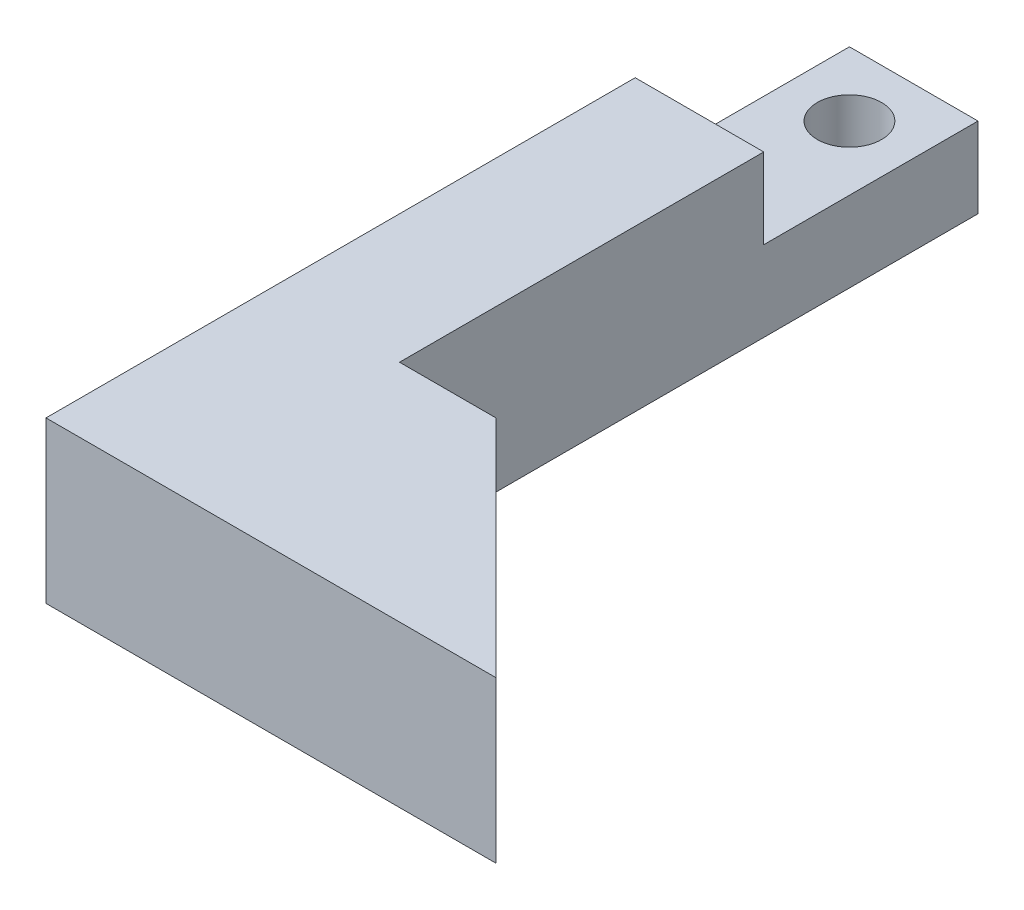
ISO-10303-21;
HEADER;
FILE_DESCRIPTION(('STEP AP214'),'2;1');
FILE_NAME('part.step','',(''),(''),'','','');
FILE_SCHEMA(('AUTOMOTIVE_DESIGN { 1 0 10303 214 1 1 1 1 }'));
ENDSEC;
DATA;
#1=APPLICATION_CONTEXT('core data for automotive mechanical design processes');
#2=APPLICATION_PROTOCOL_DEFINITION('international standard','automotive_design',2000,#1);
#3=PRODUCT_CONTEXT('',#1,'mechanical');
#4=PRODUCT('Part','Part','',(#3));
#5=PRODUCT_RELATED_PRODUCT_CATEGORY('part','',(#4));
#6=PRODUCT_DEFINITION_FORMATION('','',#4);
#7=PRODUCT_DEFINITION_CONTEXT('part definition',#1,'design');
#8=PRODUCT_DEFINITION('design','',#6,#7);
#9=PRODUCT_DEFINITION_SHAPE('','',#8);
#10=(LENGTH_UNIT() NAMED_UNIT(*) SI_UNIT(.MILLI.,.METRE.));
#11=(NAMED_UNIT(*) PLANE_ANGLE_UNIT() SI_UNIT($,.RADIAN.));
#12=(NAMED_UNIT(*) SI_UNIT($,.STERADIAN.) SOLID_ANGLE_UNIT());
#13=UNCERTAINTY_MEASURE_WITH_UNIT(LENGTH_MEASURE(1.E-05),#10,'distance_accuracy_value','');
#14=(GEOMETRIC_REPRESENTATION_CONTEXT(3) GLOBAL_UNCERTAINTY_ASSIGNED_CONTEXT((#13)) GLOBAL_UNIT_ASSIGNED_CONTEXT((#10,
#11,#12)) REPRESENTATION_CONTEXT('',''));
#15=CARTESIAN_POINT('',(0.,0.,0.));
#16=DIRECTION('',(0.,0.,1.));
#17=DIRECTION('',(1.,0.,0.));
#18=AXIS2_PLACEMENT_3D('',#15,#16,#17);
#19=CARTESIAN_POINT('',(-10.5540619028805,43.75,-62.8774836734675));
#20=DIRECTION('',(0.,0.,1.));
#21=DIRECTION('',(1.,0.,0.));
#22=AXIS2_PLACEMENT_3D('',#19,#20,#21);
#23=PLANE('',#22);
#24=DIRECTION('',(-1.,0.,0.));
#25=VECTOR('',#24,1.);
#26=CARTESIAN_POINT('',(-10.5540619028805,25.,-62.8774836734675));
#27=LINE('',#26,#25);
#28=CARTESIAN_POINT('',(19.4459380971195,25.,-62.8774836734675));
#29=VERTEX_POINT('',#28);
#30=CARTESIAN_POINT('',(-10.5540619028805,25.,-62.8774836734675));
#31=VERTEX_POINT('',#30);
#32=EDGE_CURVE('E291',#29,#31,#27,.T.);
#33=ORIENTED_EDGE('',*,*,#32,.F.);
#34=DIRECTION('',(0.,-1.,0.));
#35=VECTOR('',#34,1.);
#36=CARTESIAN_POINT('',(19.4459380971195,43.75,-62.8774836734675));
#37=LINE('',#36,#35);
#38=CARTESIAN_POINT('',(19.4459380971195,6.25,-62.8774836734675));
#39=VERTEX_POINT('',#38);
#40=EDGE_CURVE('E329',#29,#39,#37,.T.);
#41=ORIENTED_EDGE('',*,*,#40,.T.);
#42=DIRECTION('',(-1.,0.,0.));
#43=VECTOR('',#42,1.);
#44=CARTESIAN_POINT('',(-10.5540619028805,6.25,-62.8774836734675));
#45=LINE('',#44,#43);
#46=CARTESIAN_POINT('',(-10.5540619028805,6.25,-62.8774836734675));
#47=VERTEX_POINT('',#46);
#48=EDGE_CURVE('E325',#39,#47,#45,.T.);
#49=ORIENTED_EDGE('',*,*,#48,.T.);
#50=DIRECTION('',(0.,-1.,0.));
#51=VECTOR('',#50,1.);
#52=CARTESIAN_POINT('',(-10.5540619028805,43.75,-62.8774836734675));
#53=LINE('',#52,#51);
#54=EDGE_CURVE('E327',#31,#47,#53,.T.);
#55=ORIENTED_EDGE('',*,*,#54,.F.);
#56=EDGE_LOOP('',(#33,#41,#49,#55));
#57=FACE_BOUND('',#56,.T.);
#58=ADVANCED_FACE('F202',(#57),#23,.F.);
#59=CARTESIAN_POINT('',(-10.5540619028805,43.75,-62.8774836734675));
#60=DIRECTION('',(1.,0.,0.));
#61=DIRECTION('',(0.,0.,-1.));
#62=AXIS2_PLACEMENT_3D('',#59,#60,#61);
#63=PLANE('',#62);
#64=DIRECTION('',(0.,0.,1.));
#65=VECTOR('',#64,1.);
#66=CARTESIAN_POINT('',(-10.5540619028805,25.,-62.8774836734675));
#67=LINE('',#66,#65);
#68=CARTESIAN_POINT('',(-10.5540619028805,25.,-12.8774836734675));
#69=VERTEX_POINT('',#68);
#70=EDGE_CURVE('E289',#31,#69,#67,.T.);
#71=ORIENTED_EDGE('',*,*,#70,.F.);
#72=ORIENTED_EDGE('',*,*,#54,.T.);
#73=DIRECTION('',(0.,0.,1.));
#74=VECTOR('',#73,1.);
#75=CARTESIAN_POINT('',(-10.5540619028805,6.25,-62.8774836734675));
#76=LINE('',#75,#74);
#77=CARTESIAN_POINT('',(-10.5540619028804,6.25,124.622516326533));
#78=VERTEX_POINT('',#77);
#79=EDGE_CURVE('E256',#47,#78,#76,.T.);
#80=ORIENTED_EDGE('',*,*,#79,.T.);
#81=DIRECTION('',(0.,-1.,0.));
#82=VECTOR('',#81,1.);
#83=CARTESIAN_POINT('',(-10.5540619028804,43.75,124.622516326533));
#84=LINE('',#83,#82);
#85=CARTESIAN_POINT('',(-10.5540619028804,43.75,124.622516326533));
#86=VERTEX_POINT('',#85);
#87=EDGE_CURVE('E311',#86,#78,#84,.T.);
#88=ORIENTED_EDGE('',*,*,#87,.F.);
#89=DIRECTION('',(0.,0.,1.));
#90=VECTOR('',#89,1.);
#91=CARTESIAN_POINT('',(-10.5540619028805,43.75,-62.8774836734675));
#92=LINE('',#91,#90);
#93=CARTESIAN_POINT('',(-10.5540619028805,43.75,-12.8774836734675));
#94=VERTEX_POINT('',#93);
#95=EDGE_CURVE('E229',#94,#86,#92,.T.);
#96=ORIENTED_EDGE('',*,*,#95,.F.);
#97=DIRECTION('',(0.,1.,0.));
#98=VECTOR('',#97,1.);
#99=CARTESIAN_POINT('',(-10.5540619028805,25.,-12.8774836734675));
#100=LINE('',#99,#98);
#101=EDGE_CURVE('E225',#69,#94,#100,.T.);
#102=ORIENTED_EDGE('',*,*,#101,.F.);
#103=EDGE_LOOP('',(#71,#72,#80,#88,#96,#102));
#104=FACE_BOUND('',#103,.T.);
#105=ADVANCED_FACE('F300',(#104),#63,.F.);
#106=CARTESIAN_POINT('',(4.44593809711955,-14.,-47.8774836734675));
#107=DIRECTION('',(0.,1.,0.));
#108=DIRECTION('',(0.,0.,1.));
#109=AXIS2_PLACEMENT_3D('',#106,#107,#108);
#110=CYLINDRICAL_SURFACE('',#109,7.5);
#111=CARTESIAN_POINT('',(4.44593809711955,6.25,-47.8774836734675));
#112=DIRECTION('',(0.,1.,0.));
#113=DIRECTION('',(0.,0.,1.));
#114=AXIS2_PLACEMENT_3D('',#111,#112,#113);
#115=CIRCLE('',#114,7.5);
#116=CARTESIAN_POINT('',(4.44593809711955,6.25,-40.3774836734675));
#117=VERTEX_POINT('',#116);
#118=EDGE_CURVE('E320',#117,#117,#115,.T.);
#119=ORIENTED_EDGE('',*,*,#118,.F.);
#120=EDGE_LOOP('',(#119));
#121=FACE_BOUND('',#120,.T.);
#122=CARTESIAN_POINT('',(4.44593809711955,25.,-47.8774836734675));
#123=DIRECTION('',(0.,1.,0.));
#124=DIRECTION('',(0.,0.,1.));
#125=AXIS2_PLACEMENT_3D('',#122,#123,#124);
#126=CIRCLE('',#125,7.5);
#127=CARTESIAN_POINT('',(4.44593809711955,25.,-40.3774836734675));
#128=VERTEX_POINT('',#127);
#129=EDGE_CURVE('E207',#128,#128,#126,.F.);
#130=ORIENTED_EDGE('',*,*,#129,.F.);
#131=EDGE_LOOP('',(#130));
#132=FACE_BOUND('',#131,.T.);
#133=ADVANCED_FACE('F344',(#121,#132),#110,.F.);
#134=CARTESIAN_POINT('',(41.9459380971196,43.75,72.1225163265324));
#135=DIRECTION('',(-0.707106781186546,0.,0.707106781186549));
#136=DIRECTION('',(0.707106781186549,0.,0.707106781186546));
#137=AXIS2_PLACEMENT_3D('',#134,#135,#136);
#138=PLANE('',#137);
#139=DIRECTION('',(-0.707106781186549,0.,-0.707106781186546));
#140=VECTOR('',#139,1.);
#141=CARTESIAN_POINT('',(41.9459380971196,6.25,72.1225163265324));
#142=LINE('',#141,#140);
#143=CARTESIAN_POINT('',(94.4459380971198,6.25,124.622516326532));
#144=VERTEX_POINT('',#143);
#145=CARTESIAN_POINT('',(41.9459380971196,6.25,72.1225163265324));
#146=VERTEX_POINT('',#145);
#147=EDGE_CURVE('E314',#144,#146,#142,.T.);
#148=ORIENTED_EDGE('',*,*,#147,.T.);
#149=DIRECTION('',(0.,-1.,0.));
#150=VECTOR('',#149,1.);
#151=CARTESIAN_POINT('',(41.9459380971196,43.75,72.1225163265324));
#152=LINE('',#151,#150);
#153=CARTESIAN_POINT('',(41.9459380971196,43.75,72.1225163265324));
#154=VERTEX_POINT('',#153);
#155=EDGE_CURVE('E212',#154,#146,#152,.T.);
#156=ORIENTED_EDGE('',*,*,#155,.F.);
#157=DIRECTION('',(-0.707106781186549,0.,-0.707106781186546));
#158=VECTOR('',#157,1.);
#159=CARTESIAN_POINT('',(41.9459380971196,43.75,72.1225163265324));
#160=LINE('',#159,#158);
#161=CARTESIAN_POINT('',(94.4459380971198,43.75,124.622516326532));
#162=VERTEX_POINT('',#161);
#163=EDGE_CURVE('E264',#162,#154,#160,.T.);
#164=ORIENTED_EDGE('',*,*,#163,.F.);
#165=DIRECTION('',(0.,-1.,0.));
#166=VECTOR('',#165,1.);
#167=CARTESIAN_POINT('',(94.4459380971198,43.75,124.622516326532));
#168=LINE('',#167,#166);
#169=EDGE_CURVE('E13',#162,#144,#168,.T.);
#170=ORIENTED_EDGE('',*,*,#169,.T.);
#171=EDGE_LOOP('',(#148,#156,#164,#170));
#172=FACE_BOUND('',#171,.T.);
#173=ADVANCED_FACE('F210',(#172),#138,.F.);
#174=CARTESIAN_POINT('',(19.4459380971195,43.75,72.1225163265324));
#175=DIRECTION('',(0.,0.,1.));
#176=DIRECTION('',(1.,0.,0.));
#177=AXIS2_PLACEMENT_3D('',#174,#175,#176);
#178=PLANE('',#177);
#179=DIRECTION('',(-1.,0.,0.));
#180=VECTOR('',#179,1.);
#181=CARTESIAN_POINT('',(19.4459380971195,6.25,72.1225163265324));
#182=LINE('',#181,#180);
#183=CARTESIAN_POINT('',(19.4459380971195,6.25,72.1225163265324));
#184=VERTEX_POINT('',#183);
#185=EDGE_CURVE('E316',#146,#184,#182,.T.);
#186=ORIENTED_EDGE('',*,*,#185,.T.);
#187=DIRECTION('',(0.,-1.,0.));
#188=VECTOR('',#187,1.);
#189=CARTESIAN_POINT('',(19.4459380971195,43.75,72.1225163265324));
#190=LINE('',#189,#188);
#191=CARTESIAN_POINT('',(19.4459380971195,43.75,72.1225163265324));
#192=VERTEX_POINT('',#191);
#193=EDGE_CURVE('E335',#192,#184,#190,.T.);
#194=ORIENTED_EDGE('',*,*,#193,.F.);
#195=DIRECTION('',(-1.,0.,0.));
#196=VECTOR('',#195,1.);
#197=CARTESIAN_POINT('',(19.4459380971195,43.75,72.1225163265324));
#198=LINE('',#197,#196);
#199=EDGE_CURVE('E307',#154,#192,#198,.T.);
#200=ORIENTED_EDGE('',*,*,#199,.F.);
#201=ORIENTED_EDGE('',*,*,#155,.T.);
#202=EDGE_LOOP('',(#186,#194,#200,#201));
#203=FACE_BOUND('',#202,.T.);
#204=ADVANCED_FACE('F348',(#203),#178,.F.);
#205=CARTESIAN_POINT('',(19.4459380971195,43.75,72.1225163265324));
#206=DIRECTION('',(-1.,0.,0.));
#207=DIRECTION('',(0.,0.,1.));
#208=AXIS2_PLACEMENT_3D('',#205,#206,#207);
#209=PLANE('',#208);
#210=DIRECTION('',(0.,0.,-1.));
#211=VECTOR('',#210,1.);
#212=CARTESIAN_POINT('',(19.4459380971195,25.,-62.8774836734675));
#213=LINE('',#212,#211);
#214=CARTESIAN_POINT('',(19.4459380971195,25.,-12.8774836734675));
#215=VERTEX_POINT('',#214);
#216=EDGE_CURVE('E287',#215,#29,#213,.T.);
#217=ORIENTED_EDGE('',*,*,#216,.F.);
#218=DIRECTION('',(0.,1.,0.));
#219=VECTOR('',#218,1.);
#220=CARTESIAN_POINT('',(19.4459380971195,25.,-12.8774836734675));
#221=LINE('',#220,#219);
#222=CARTESIAN_POINT('',(19.4459380971195,43.75,-12.8774836734675));
#223=VERTEX_POINT('',#222);
#224=EDGE_CURVE('E282',#215,#223,#221,.T.);
#225=ORIENTED_EDGE('',*,*,#224,.T.);
#226=DIRECTION('',(0.,0.,-1.));
#227=VECTOR('',#226,1.);
#228=CARTESIAN_POINT('',(19.4459380971195,43.75,72.1225163265324));
#229=LINE('',#228,#227);
#230=EDGE_CURVE('E310',#192,#223,#229,.T.);
#231=ORIENTED_EDGE('',*,*,#230,.F.);
#232=ORIENTED_EDGE('',*,*,#193,.T.);
#233=DIRECTION('',(0.,0.,-1.));
#234=VECTOR('',#233,1.);
#235=CARTESIAN_POINT('',(19.4459380971195,6.25,72.1225163265324));
#236=LINE('',#235,#234);
#237=EDGE_CURVE('E317',#184,#39,#236,.T.);
#238=ORIENTED_EDGE('',*,*,#237,.T.);
#239=ORIENTED_EDGE('',*,*,#40,.F.);
#240=EDGE_LOOP('',(#217,#225,#231,#232,#238,#239));
#241=FACE_BOUND('',#240,.T.);
#242=ADVANCED_FACE('F363',(#241),#209,.F.);
#243=CARTESIAN_POINT('',(-10.5540619028804,43.75,124.622516326533));
#244=DIRECTION('',(0.,0.,-1.));
#245=DIRECTION('',(-1.,0.,0.));
#246=AXIS2_PLACEMENT_3D('',#243,#244,#245);
#247=PLANE('',#246);
#248=DIRECTION('',(1.,0.,0.));
#249=VECTOR('',#248,1.);
#250=CARTESIAN_POINT('',(-10.5540619028804,6.25,124.622516326533));
#251=LINE('',#250,#249);
#252=EDGE_CURVE('E303',#78,#144,#251,.T.);
#253=ORIENTED_EDGE('',*,*,#252,.T.);
#254=ORIENTED_EDGE('',*,*,#169,.F.);
#255=DIRECTION('',(1.,0.,0.));
#256=VECTOR('',#255,1.);
#257=CARTESIAN_POINT('',(94.4459380971198,43.75,124.622516326532));
#258=LINE('',#257,#256);
#259=EDGE_CURVE('E305',#86,#162,#258,.T.);
#260=ORIENTED_EDGE('',*,*,#259,.F.);
#261=ORIENTED_EDGE('',*,*,#87,.T.);
#262=EDGE_LOOP('',(#253,#254,#260,#261));
#263=FACE_BOUND('',#262,.T.);
#264=ADVANCED_FACE('F362',(#263),#247,.F.);
#265=CARTESIAN_POINT('',(4.44593809711955,43.75,13.9225842440055));
#266=DIRECTION('',(0.,1.,0.));
#267=DIRECTION('',(0.,0.,1.));
#268=AXIS2_PLACEMENT_3D('',#265,#266,#267);
#269=PLANE('',#268);
#270=DIRECTION('',(1.,0.,0.));
#271=VECTOR('',#270,1.);
#272=CARTESIAN_POINT('',(-10.5540619028805,43.75,-12.8774836734675));
#273=LINE('',#272,#271);
#274=EDGE_CURVE('E293',#94,#223,#273,.T.);
#275=ORIENTED_EDGE('',*,*,#274,.F.);
#276=ORIENTED_EDGE('',*,*,#95,.T.);
#277=ORIENTED_EDGE('',*,*,#259,.T.);
#278=ORIENTED_EDGE('',*,*,#163,.T.);
#279=ORIENTED_EDGE('',*,*,#199,.T.);
#280=ORIENTED_EDGE('',*,*,#230,.T.);
#281=EDGE_LOOP('',(#275,#276,#277,#278,#279,#280));
#282=FACE_BOUND('',#281,.T.);
#283=ADVANCED_FACE('F379',(#282),#269,.T.);
#284=CARTESIAN_POINT('',(4.44593809711955,6.25,13.9225842440055));
#285=DIRECTION('',(0.,1.,0.));
#286=DIRECTION('',(0.,0.,1.));
#287=AXIS2_PLACEMENT_3D('',#284,#285,#286);
#288=PLANE('',#287);
#289=ORIENTED_EDGE('',*,*,#118,.T.);
#290=EDGE_LOOP('',(#289));
#291=FACE_BOUND('',#290,.T.);
#292=ORIENTED_EDGE('',*,*,#147,.F.);
#293=ORIENTED_EDGE('',*,*,#252,.F.);
#294=ORIENTED_EDGE('',*,*,#79,.F.);
#295=ORIENTED_EDGE('',*,*,#48,.F.);
#296=ORIENTED_EDGE('',*,*,#237,.F.);
#297=ORIENTED_EDGE('',*,*,#185,.F.);
#298=EDGE_LOOP('',(#292,#293,#294,#295,#296,#297));
#299=FACE_BOUND('',#298,.T.);
#300=ADVANCED_FACE('F380',(#291,#299),#288,.F.);
#301=CARTESIAN_POINT('',(0.,25.,0.));
#302=DIRECTION('',(0.,1.,0.));
#303=DIRECTION('',(0.,0.,1.));
#304=AXIS2_PLACEMENT_3D('',#301,#302,#303);
#305=PLANE('',#304);
#306=ORIENTED_EDGE('',*,*,#70,.T.);
#307=DIRECTION('',(1.,0.,0.));
#308=VECTOR('',#307,1.);
#309=CARTESIAN_POINT('',(-10.5540619028805,25.,-12.8774836734675));
#310=LINE('',#309,#308);
#311=EDGE_CURVE('E276',#69,#215,#310,.T.);
#312=ORIENTED_EDGE('',*,*,#311,.T.);
#313=ORIENTED_EDGE('',*,*,#216,.T.);
#314=ORIENTED_EDGE('',*,*,#32,.T.);
#315=EDGE_LOOP('',(#306,#312,#313,#314));
#316=FACE_BOUND('',#315,.T.);
#317=ORIENTED_EDGE('',*,*,#129,.T.);
#318=EDGE_LOOP('',(#317));
#319=FACE_BOUND('',#318,.T.);
#320=ADVANCED_FACE('F288',(#316,#319),#305,.T.);
#321=CARTESIAN_POINT('',(-10.5540619028805,25.,-12.8774836734675));
#322=DIRECTION('',(0.,0.,1.));
#323=DIRECTION('',(1.,0.,0.));
#324=AXIS2_PLACEMENT_3D('',#321,#322,#323);
#325=PLANE('',#324);
#326=ORIENTED_EDGE('',*,*,#274,.T.);
#327=ORIENTED_EDGE('',*,*,#224,.F.);
#328=ORIENTED_EDGE('',*,*,#311,.F.);
#329=ORIENTED_EDGE('',*,*,#101,.T.);
#330=EDGE_LOOP('',(#326,#327,#328,#329));
#331=FACE_BOUND('',#330,.T.);
#332=ADVANCED_FACE('F281',(#331),#325,.F.);
#333=CLOSED_SHELL('',(#58,#105,#133,#173,#204,#242,#264,#283,#300,#320,#332));
#334=MANIFOLD_SOLID_BREP('B2',#333);
#335=ADVANCED_BREP_SHAPE_REPRESENTATION('',(#18,#334),#14);
#336=SHAPE_DEFINITION_REPRESENTATION(#9,#335);
ENDSEC;
END-ISO-10303-21;
